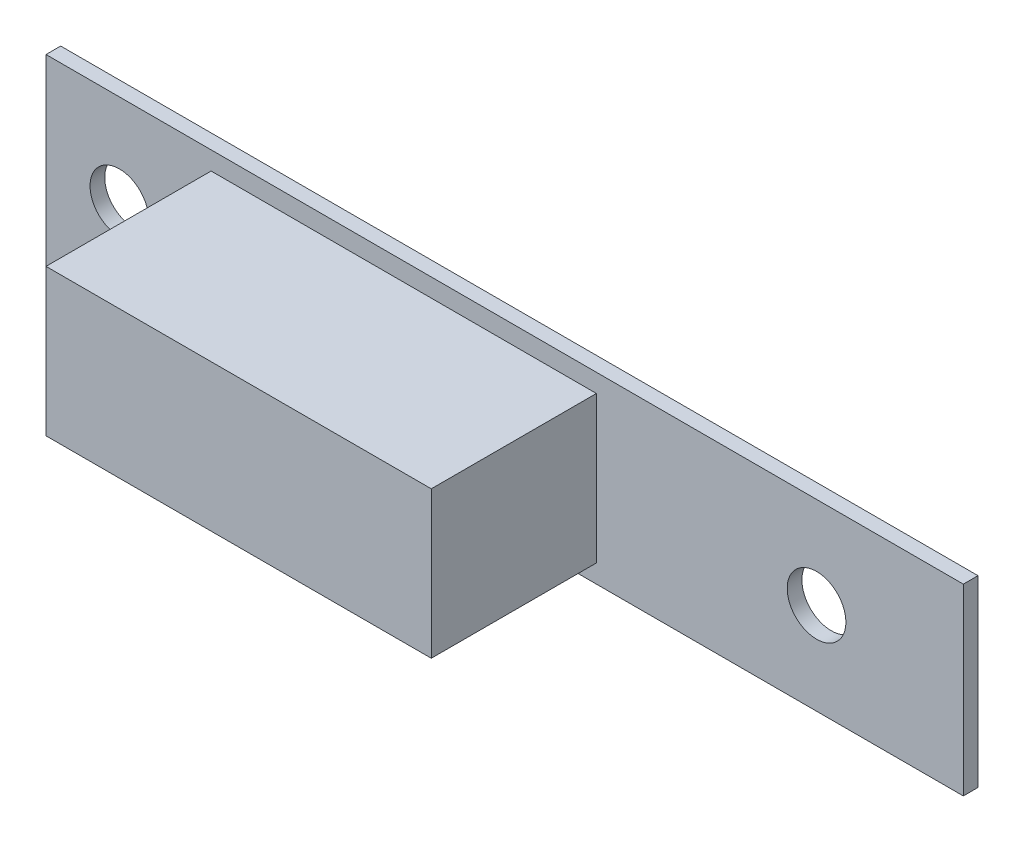
ISO-10303-21;
HEADER;
FILE_DESCRIPTION(('STEP AP214'),'2;1');
FILE_NAME('part.step','',(''),(''),'','','');
FILE_SCHEMA(('AUTOMOTIVE_DESIGN { 1 0 10303 214 1 1 1 1 }'));
ENDSEC;
DATA;
#1=APPLICATION_CONTEXT('core data for automotive mechanical design processes');
#2=APPLICATION_PROTOCOL_DEFINITION('international standard','automotive_design',2000,#1);
#3=PRODUCT_CONTEXT('',#1,'mechanical');
#4=PRODUCT('Part','Part','',(#3));
#5=PRODUCT_RELATED_PRODUCT_CATEGORY('part','',(#4));
#6=PRODUCT_DEFINITION_FORMATION('','',#4);
#7=PRODUCT_DEFINITION_CONTEXT('part definition',#1,'design');
#8=PRODUCT_DEFINITION('design','',#6,#7);
#9=PRODUCT_DEFINITION_SHAPE('','',#8);
#10=(LENGTH_UNIT() NAMED_UNIT(*) SI_UNIT(.MILLI.,.METRE.));
#11=(NAMED_UNIT(*) PLANE_ANGLE_UNIT() SI_UNIT($,.RADIAN.));
#12=(NAMED_UNIT(*) SI_UNIT($,.STERADIAN.) SOLID_ANGLE_UNIT());
#13=UNCERTAINTY_MEASURE_WITH_UNIT(LENGTH_MEASURE(1.E-05),#10,'distance_accuracy_value','');
#14=(GEOMETRIC_REPRESENTATION_CONTEXT(3) GLOBAL_UNCERTAINTY_ASSIGNED_CONTEXT((#13)) GLOBAL_UNIT_ASSIGNED_CONTEXT((#10,
#11,#12)) REPRESENTATION_CONTEXT('',''));
#15=CARTESIAN_POINT('',(0.,0.,0.));
#16=DIRECTION('',(0.,0.,1.));
#17=DIRECTION('',(1.,0.,0.));
#18=AXIS2_PLACEMENT_3D('',#15,#16,#17);
#19=CARTESIAN_POINT('',(0.,0.,0.8));
#20=DIRECTION('',(0.,0.,-1.));
#21=DIRECTION('',(-1.,0.,0.));
#22=AXIS2_PLACEMENT_3D('',#19,#20,#21);
#23=PLANE('',#22);
#24=CARTESIAN_POINT('',(42.,5.,0.8));
#25=DIRECTION('',(0.,0.,1.));
#26=DIRECTION('',(1.,0.,0.));
#27=AXIS2_PLACEMENT_3D('',#24,#25,#26);
#28=CIRCLE('',#27,1.6);
#29=CARTESIAN_POINT('',(43.6,5.,0.8));
#30=VERTEX_POINT('',#29);
#31=EDGE_CURVE('E124',#30,#30,#28,.T.);
#32=ORIENTED_EDGE('',*,*,#31,.F.);
#33=EDGE_LOOP('',(#32));
#34=FACE_BOUND('',#33,.T.);
#35=DIRECTION('',(0.,-1.,0.));
#36=VECTOR('',#35,1.);
#37=CARTESIAN_POINT('',(0.,0.,0.8));
#38=LINE('',#37,#36);
#39=CARTESIAN_POINT('',(0.,10.,0.8));
#40=VERTEX_POINT('',#39);
#41=CARTESIAN_POINT('',(0.,0.,0.8));
#42=VERTEX_POINT('',#41);
#43=EDGE_CURVE('E139',#40,#42,#38,.T.);
#44=ORIENTED_EDGE('',*,*,#43,.T.);
#45=DIRECTION('',(1.,0.,0.));
#46=VECTOR('',#45,1.);
#47=CARTESIAN_POINT('',(0.,0.,0.8));
#48=LINE('',#47,#46);
#49=CARTESIAN_POINT('',(50.,0.,0.8));
#50=VERTEX_POINT('',#49);
#51=EDGE_CURVE('E142',#42,#50,#48,.T.);
#52=ORIENTED_EDGE('',*,*,#51,.T.);
#53=DIRECTION('',(0.,1.,0.));
#54=VECTOR('',#53,1.);
#55=CARTESIAN_POINT('',(50.,0.,0.8));
#56=LINE('',#55,#54);
#57=CARTESIAN_POINT('',(50.,10.,0.8));
#58=VERTEX_POINT('',#57);
#59=EDGE_CURVE('E145',#50,#58,#56,.T.);
#60=ORIENTED_EDGE('',*,*,#59,.T.);
#61=DIRECTION('',(-1.,0.,0.));
#62=VECTOR('',#61,1.);
#63=CARTESIAN_POINT('',(0.,10.,0.8));
#64=LINE('',#63,#62);
#65=EDGE_CURVE('E147',#58,#40,#64,.T.);
#66=ORIENTED_EDGE('',*,*,#65,.T.);
#67=EDGE_LOOP('',(#44,#52,#60,#66));
#68=FACE_BOUND('',#67,.T.);
#69=CARTESIAN_POINT('',(4.,5.,0.8));
#70=DIRECTION('',(0.,0.,1.));
#71=DIRECTION('',(1.,0.,0.));
#72=AXIS2_PLACEMENT_3D('',#69,#70,#71);
#73=CIRCLE('',#72,1.6);
#74=CARTESIAN_POINT('',(5.6,5.,0.8));
#75=VERTEX_POINT('',#74);
#76=EDGE_CURVE('E133',#75,#75,#73,.T.);
#77=ORIENTED_EDGE('',*,*,#76,.F.);
#78=EDGE_LOOP('',(#77));
#79=FACE_BOUND('',#78,.T.);
#80=DIRECTION('',(0.,-1.,0.));
#81=VECTOR('',#80,1.);
#82=CARTESIAN_POINT('',(9.,9.,0.8));
#83=LINE('',#82,#81);
#84=CARTESIAN_POINT('',(9.,9.,0.8));
#85=VERTEX_POINT('',#84);
#86=CARTESIAN_POINT('',(9.,1.,0.8));
#87=VERTEX_POINT('',#86);
#88=EDGE_CURVE('E120',#85,#87,#83,.T.);
#89=ORIENTED_EDGE('',*,*,#88,.F.);
#90=DIRECTION('',(-1.,0.,0.));
#91=VECTOR('',#90,1.);
#92=CARTESIAN_POINT('',(9.,9.,0.8));
#93=LINE('',#92,#91);
#94=CARTESIAN_POINT('',(30.,9.,0.8));
#95=VERTEX_POINT('',#94);
#96=EDGE_CURVE('E117',#95,#85,#93,.T.);
#97=ORIENTED_EDGE('',*,*,#96,.F.);
#98=DIRECTION('',(0.,1.,0.));
#99=VECTOR('',#98,1.);
#100=CARTESIAN_POINT('',(30.,9.,0.8));
#101=LINE('',#100,#99);
#102=CARTESIAN_POINT('',(30.,0.999999999999999,0.8));
#103=VERTEX_POINT('',#102);
#104=EDGE_CURVE('E55',#103,#95,#101,.T.);
#105=ORIENTED_EDGE('',*,*,#104,.F.);
#106=DIRECTION('',(1.,0.,0.));
#107=VECTOR('',#106,1.);
#108=CARTESIAN_POINT('',(9.,1.,0.8));
#109=LINE('',#108,#107);
#110=EDGE_CURVE('E50',#87,#103,#109,.T.);
#111=ORIENTED_EDGE('',*,*,#110,.F.);
#112=EDGE_LOOP('',(#89,#97,#105,#111));
#113=FACE_BOUND('',#112,.T.);
#114=ADVANCED_FACE('F35',(#34,#68,#79,#113),#23,.F.);
#115=CARTESIAN_POINT('',(0.,0.,0.));
#116=DIRECTION('',(0.,0.,-1.));
#117=DIRECTION('',(-1.,0.,0.));
#118=AXIS2_PLACEMENT_3D('',#115,#116,#117);
#119=PLANE('',#118);
#120=CARTESIAN_POINT('',(4.,5.,0.));
#121=DIRECTION('',(0.,0.,1.));
#122=DIRECTION('',(1.,0.,0.));
#123=AXIS2_PLACEMENT_3D('',#120,#121,#122);
#124=CIRCLE('',#123,1.6);
#125=CARTESIAN_POINT('',(5.6,5.,0.));
#126=VERTEX_POINT('',#125);
#127=EDGE_CURVE('E131',#126,#126,#124,.T.);
#128=ORIENTED_EDGE('',*,*,#127,.T.);
#129=EDGE_LOOP('',(#128));
#130=FACE_BOUND('',#129,.T.);
#131=DIRECTION('',(0.,-1.,0.));
#132=VECTOR('',#131,1.);
#133=CARTESIAN_POINT('',(0.,0.,0.));
#134=LINE('',#133,#132);
#135=CARTESIAN_POINT('',(0.,10.,0.));
#136=VERTEX_POINT('',#135);
#137=CARTESIAN_POINT('',(0.,0.,0.));
#138=VERTEX_POINT('',#137);
#139=EDGE_CURVE('E136',#136,#138,#134,.T.);
#140=ORIENTED_EDGE('',*,*,#139,.F.);
#141=DIRECTION('',(-1.,0.,0.));
#142=VECTOR('',#141,1.);
#143=CARTESIAN_POINT('',(0.,10.,0.));
#144=LINE('',#143,#142);
#145=CARTESIAN_POINT('',(50.,10.,0.));
#146=VERTEX_POINT('',#145);
#147=EDGE_CURVE('E143',#146,#136,#144,.T.);
#148=ORIENTED_EDGE('',*,*,#147,.F.);
#149=DIRECTION('',(0.,1.,0.));
#150=VECTOR('',#149,1.);
#151=CARTESIAN_POINT('',(50.,0.,0.));
#152=LINE('',#151,#150);
#153=CARTESIAN_POINT('',(50.,0.,0.));
#154=VERTEX_POINT('',#153);
#155=EDGE_CURVE('E154',#154,#146,#152,.T.);
#156=ORIENTED_EDGE('',*,*,#155,.F.);
#157=DIRECTION('',(1.,0.,0.));
#158=VECTOR('',#157,1.);
#159=CARTESIAN_POINT('',(0.,0.,0.));
#160=LINE('',#159,#158);
#161=EDGE_CURVE('E152',#138,#154,#160,.T.);
#162=ORIENTED_EDGE('',*,*,#161,.F.);
#163=EDGE_LOOP('',(#140,#148,#156,#162));
#164=FACE_BOUND('',#163,.T.);
#165=CARTESIAN_POINT('',(42.,5.,0.));
#166=DIRECTION('',(0.,0.,1.));
#167=DIRECTION('',(1.,0.,0.));
#168=AXIS2_PLACEMENT_3D('',#165,#166,#167);
#169=CIRCLE('',#168,1.6);
#170=CARTESIAN_POINT('',(43.6,5.,0.));
#171=VERTEX_POINT('',#170);
#172=EDGE_CURVE('E121',#171,#171,#169,.T.);
#173=ORIENTED_EDGE('',*,*,#172,.T.);
#174=EDGE_LOOP('',(#173));
#175=FACE_BOUND('',#174,.T.);
#176=ADVANCED_FACE('F172',(#130,#164,#175),#119,.T.);
#177=CARTESIAN_POINT('',(0.,0.,0.8));
#178=DIRECTION('',(1.,0.,0.));
#179=DIRECTION('',(0.,0.,-1.));
#180=AXIS2_PLACEMENT_3D('',#177,#178,#179);
#181=PLANE('',#180);
#182=ORIENTED_EDGE('',*,*,#139,.T.);
#183=DIRECTION('',(0.,0.,-1.));
#184=VECTOR('',#183,1.);
#185=CARTESIAN_POINT('',(0.,0.,0.8));
#186=LINE('',#185,#184);
#187=EDGE_CURVE('E11',#42,#138,#186,.T.);
#188=ORIENTED_EDGE('',*,*,#187,.F.);
#189=ORIENTED_EDGE('',*,*,#43,.F.);
#190=DIRECTION('',(0.,0.,-1.));
#191=VECTOR('',#190,1.);
#192=CARTESIAN_POINT('',(0.,10.,0.8));
#193=LINE('',#192,#191);
#194=EDGE_CURVE('E149',#40,#136,#193,.T.);
#195=ORIENTED_EDGE('',*,*,#194,.T.);
#196=EDGE_LOOP('',(#182,#188,#189,#195));
#197=FACE_BOUND('',#196,.T.);
#198=ADVANCED_FACE('F37',(#197),#181,.F.);
#199=CARTESIAN_POINT('',(0.,0.,0.8));
#200=DIRECTION('',(0.,1.,0.));
#201=DIRECTION('',(0.,0.,1.));
#202=AXIS2_PLACEMENT_3D('',#199,#200,#201);
#203=PLANE('',#202);
#204=ORIENTED_EDGE('',*,*,#161,.T.);
#205=DIRECTION('',(0.,0.,-1.));
#206=VECTOR('',#205,1.);
#207=CARTESIAN_POINT('',(50.,0.,0.8));
#208=LINE('',#207,#206);
#209=EDGE_CURVE('E43',#50,#154,#208,.T.);
#210=ORIENTED_EDGE('',*,*,#209,.F.);
#211=ORIENTED_EDGE('',*,*,#51,.F.);
#212=ORIENTED_EDGE('',*,*,#187,.T.);
#213=EDGE_LOOP('',(#204,#210,#211,#212));
#214=FACE_BOUND('',#213,.T.);
#215=ADVANCED_FACE('F183',(#214),#203,.F.);
#216=CARTESIAN_POINT('',(50.,0.,0.8));
#217=DIRECTION('',(-1.,0.,0.));
#218=DIRECTION('',(0.,0.,1.));
#219=AXIS2_PLACEMENT_3D('',#216,#217,#218);
#220=PLANE('',#219);
#221=ORIENTED_EDGE('',*,*,#155,.T.);
#222=DIRECTION('',(0.,0.,-1.));
#223=VECTOR('',#222,1.);
#224=CARTESIAN_POINT('',(50.,10.,0.8));
#225=LINE('',#224,#223);
#226=EDGE_CURVE('E159',#58,#146,#225,.T.);
#227=ORIENTED_EDGE('',*,*,#226,.F.);
#228=ORIENTED_EDGE('',*,*,#59,.F.);
#229=ORIENTED_EDGE('',*,*,#209,.T.);
#230=EDGE_LOOP('',(#221,#227,#228,#229));
#231=FACE_BOUND('',#230,.T.);
#232=ADVANCED_FACE('F166',(#231),#220,.F.);
#233=CARTESIAN_POINT('',(0.,10.,0.8));
#234=DIRECTION('',(0.,-1.,0.));
#235=DIRECTION('',(0.,0.,-1.));
#236=AXIS2_PLACEMENT_3D('',#233,#234,#235);
#237=PLANE('',#236);
#238=ORIENTED_EDGE('',*,*,#147,.T.);
#239=ORIENTED_EDGE('',*,*,#194,.F.);
#240=ORIENTED_EDGE('',*,*,#65,.F.);
#241=ORIENTED_EDGE('',*,*,#226,.T.);
#242=EDGE_LOOP('',(#238,#239,#240,#241));
#243=FACE_BOUND('',#242,.T.);
#244=ADVANCED_FACE('F176',(#243),#237,.F.);
#245=CARTESIAN_POINT('',(4.,5.,0.8));
#246=DIRECTION('',(0.,0.,-1.));
#247=DIRECTION('',(-1.,0.,0.));
#248=AXIS2_PLACEMENT_3D('',#245,#246,#247);
#249=CYLINDRICAL_SURFACE('',#248,1.6);
#250=ORIENTED_EDGE('',*,*,#76,.T.);
#251=EDGE_LOOP('',(#250));
#252=FACE_BOUND('',#251,.T.);
#253=ORIENTED_EDGE('',*,*,#127,.F.);
#254=EDGE_LOOP('',(#253));
#255=FACE_BOUND('',#254,.T.);
#256=ADVANCED_FACE('F200',(#252,#255),#249,.F.);
#257=CARTESIAN_POINT('',(42.,5.,0.8));
#258=DIRECTION('',(0.,0.,-1.));
#259=DIRECTION('',(-1.,0.,0.));
#260=AXIS2_PLACEMENT_3D('',#257,#258,#259);
#261=CYLINDRICAL_SURFACE('',#260,1.6);
#262=ORIENTED_EDGE('',*,*,#31,.T.);
#263=EDGE_LOOP('',(#262));
#264=FACE_BOUND('',#263,.T.);
#265=ORIENTED_EDGE('',*,*,#172,.F.);
#266=EDGE_LOOP('',(#265));
#267=FACE_BOUND('',#266,.T.);
#268=ADVANCED_FACE('F207',(#264,#267),#261,.F.);
#269=CARTESIAN_POINT('',(9.,9.,9.8));
#270=DIRECTION('',(1.,0.,0.));
#271=DIRECTION('',(0.,0.,-1.));
#272=AXIS2_PLACEMENT_3D('',#269,#270,#271);
#273=PLANE('',#272);
#274=ORIENTED_EDGE('',*,*,#88,.T.);
#275=DIRECTION('',(0.,0.,-1.));
#276=VECTOR('',#275,1.);
#277=CARTESIAN_POINT('',(9.,1.,9.8));
#278=LINE('',#277,#276);
#279=CARTESIAN_POINT('',(9.,1.,9.8));
#280=VERTEX_POINT('',#279);
#281=EDGE_CURVE('E101',#280,#87,#278,.T.);
#282=ORIENTED_EDGE('',*,*,#281,.F.);
#283=DIRECTION('',(0.,-1.,0.));
#284=VECTOR('',#283,1.);
#285=CARTESIAN_POINT('',(9.,9.,9.8));
#286=LINE('',#285,#284);
#287=CARTESIAN_POINT('',(9.,9.,9.8));
#288=VERTEX_POINT('',#287);
#289=EDGE_CURVE('E108',#288,#280,#286,.T.);
#290=ORIENTED_EDGE('',*,*,#289,.F.);
#291=DIRECTION('',(0.,0.,-1.));
#292=VECTOR('',#291,1.);
#293=CARTESIAN_POINT('',(9.,9.,9.8));
#294=LINE('',#293,#292);
#295=EDGE_CURVE('E221',#288,#85,#294,.T.);
#296=ORIENTED_EDGE('',*,*,#295,.T.);
#297=EDGE_LOOP('',(#274,#282,#290,#296));
#298=FACE_BOUND('',#297,.T.);
#299=ADVANCED_FACE('F119',(#298),#273,.F.);
#300=CARTESIAN_POINT('',(9.,1.,9.8));
#301=DIRECTION('',(0.,1.,0.));
#302=DIRECTION('',(-1.,0.,0.));
#303=AXIS2_PLACEMENT_3D('',#300,#301,#302);
#304=PLANE('',#303);
#305=ORIENTED_EDGE('',*,*,#110,.T.);
#306=DIRECTION('',(0.,0.,-1.));
#307=VECTOR('',#306,1.);
#308=CARTESIAN_POINT('',(30.,0.999999999999999,9.8));
#309=LINE('',#308,#307);
#310=CARTESIAN_POINT('',(30.,0.999999999999999,9.8));
#311=VERTEX_POINT('',#310);
#312=EDGE_CURVE('E104',#311,#103,#309,.T.);
#313=ORIENTED_EDGE('',*,*,#312,.F.);
#314=DIRECTION('',(1.,0.,0.));
#315=VECTOR('',#314,1.);
#316=CARTESIAN_POINT('',(9.,1.,9.8));
#317=LINE('',#316,#315);
#318=EDGE_CURVE('E97',#280,#311,#317,.T.);
#319=ORIENTED_EDGE('',*,*,#318,.F.);
#320=ORIENTED_EDGE('',*,*,#281,.T.);
#321=EDGE_LOOP('',(#305,#313,#319,#320));
#322=FACE_BOUND('',#321,.T.);
#323=ADVANCED_FACE('F99',(#322),#304,.F.);
#324=CARTESIAN_POINT('',(30.,9.,9.8));
#325=DIRECTION('',(-1.,0.,0.));
#326=DIRECTION('',(0.,0.,1.));
#327=AXIS2_PLACEMENT_3D('',#324,#325,#326);
#328=PLANE('',#327);
#329=ORIENTED_EDGE('',*,*,#104,.T.);
#330=DIRECTION('',(0.,0.,-1.));
#331=VECTOR('',#330,1.);
#332=CARTESIAN_POINT('',(30.,9.,9.8));
#333=LINE('',#332,#331);
#334=CARTESIAN_POINT('',(30.,9.,9.8));
#335=VERTEX_POINT('',#334);
#336=EDGE_CURVE('E126',#335,#95,#333,.T.);
#337=ORIENTED_EDGE('',*,*,#336,.F.);
#338=DIRECTION('',(0.,1.,0.));
#339=VECTOR('',#338,1.);
#340=CARTESIAN_POINT('',(30.,9.,9.8));
#341=LINE('',#340,#339);
#342=EDGE_CURVE('E107',#311,#335,#341,.T.);
#343=ORIENTED_EDGE('',*,*,#342,.F.);
#344=ORIENTED_EDGE('',*,*,#312,.T.);
#345=EDGE_LOOP('',(#329,#337,#343,#344));
#346=FACE_BOUND('',#345,.T.);
#347=ADVANCED_FACE('F230',(#346),#328,.F.);
#348=CARTESIAN_POINT('',(9.,9.,9.8));
#349=DIRECTION('',(0.,-1.,0.));
#350=DIRECTION('',(0.,0.,-1.));
#351=AXIS2_PLACEMENT_3D('',#348,#349,#350);
#352=PLANE('',#351);
#353=ORIENTED_EDGE('',*,*,#96,.T.);
#354=ORIENTED_EDGE('',*,*,#295,.F.);
#355=DIRECTION('',(-1.,0.,0.));
#356=VECTOR('',#355,1.);
#357=CARTESIAN_POINT('',(9.,9.,9.8));
#358=LINE('',#357,#356);
#359=EDGE_CURVE('E113',#335,#288,#358,.T.);
#360=ORIENTED_EDGE('',*,*,#359,.F.);
#361=ORIENTED_EDGE('',*,*,#336,.T.);
#362=EDGE_LOOP('',(#353,#354,#360,#361));
#363=FACE_BOUND('',#362,.T.);
#364=ADVANCED_FACE('F220',(#363),#352,.F.);
#365=CARTESIAN_POINT('',(0.,0.,9.8));
#366=DIRECTION('',(0.,0.,1.));
#367=DIRECTION('',(1.,0.,0.));
#368=AXIS2_PLACEMENT_3D('',#365,#366,#367);
#369=PLANE('',#368);
#370=ORIENTED_EDGE('',*,*,#289,.T.);
#371=ORIENTED_EDGE('',*,*,#318,.T.);
#372=ORIENTED_EDGE('',*,*,#342,.T.);
#373=ORIENTED_EDGE('',*,*,#359,.T.);
#374=EDGE_LOOP('',(#370,#371,#372,#373));
#375=FACE_BOUND('',#374,.T.);
#376=ADVANCED_FACE('F111',(#375),#369,.T.);
#377=CLOSED_SHELL('',(#114,#176,#198,#215,#232,#244,#256,#268,#299,#323,#347,#364,#376));
#378=MANIFOLD_SOLID_BREP('B2',#377);
#379=ADVANCED_BREP_SHAPE_REPRESENTATION('',(#18,#378),#14);
#380=SHAPE_DEFINITION_REPRESENTATION(#9,#379);
ENDSEC;
END-ISO-10303-21;
